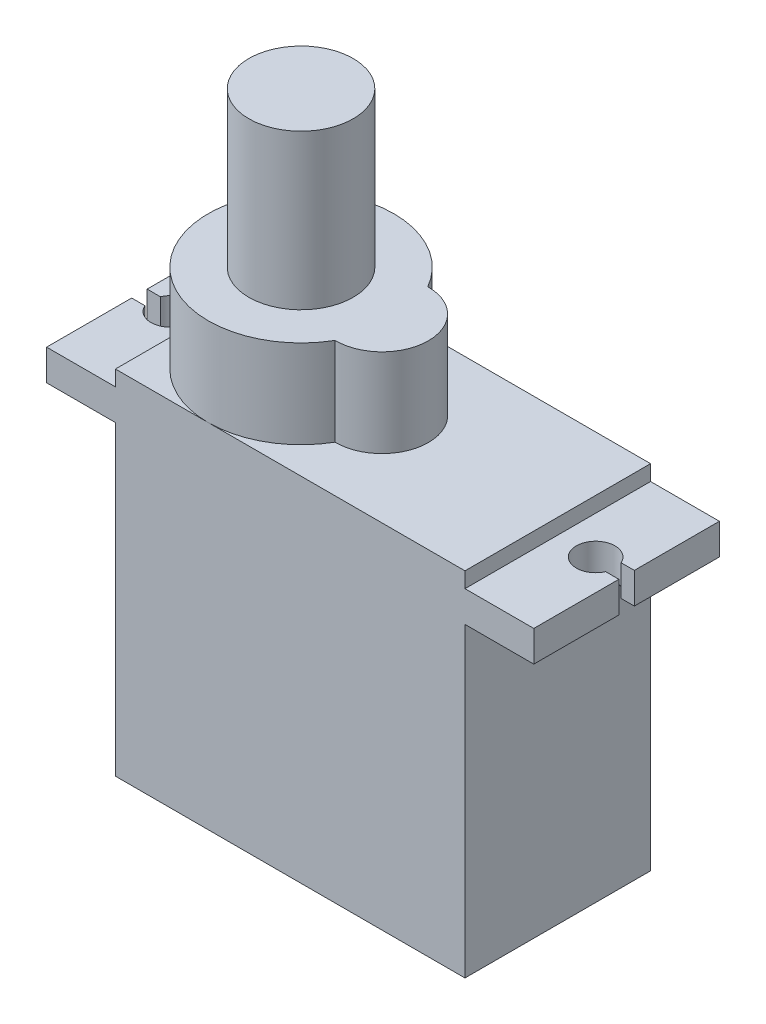
ISO-10303-21;
HEADER;
FILE_DESCRIPTION(('STEP AP214'),'2;1');
FILE_NAME('part.step','',(''),(''),'','','');
FILE_SCHEMA(('AUTOMOTIVE_DESIGN { 1 0 10303 214 1 1 1 1 }'));
ENDSEC;
DATA;
#1=APPLICATION_CONTEXT('core data for automotive mechanical design processes');
#2=APPLICATION_PROTOCOL_DEFINITION('international standard','automotive_design',2000,#1);
#3=PRODUCT_CONTEXT('',#1,'mechanical');
#4=PRODUCT('Part','Part','',(#3));
#5=PRODUCT_RELATED_PRODUCT_CATEGORY('part','',(#4));
#6=PRODUCT_DEFINITION_FORMATION('','',#4);
#7=PRODUCT_DEFINITION_CONTEXT('part definition',#1,'design');
#8=PRODUCT_DEFINITION('design','',#6,#7);
#9=PRODUCT_DEFINITION_SHAPE('','',#8);
#10=(LENGTH_UNIT() NAMED_UNIT(*) SI_UNIT(.MILLI.,.METRE.));
#11=(NAMED_UNIT(*) PLANE_ANGLE_UNIT() SI_UNIT($,.RADIAN.));
#12=(NAMED_UNIT(*) SI_UNIT($,.STERADIAN.) SOLID_ANGLE_UNIT());
#13=UNCERTAINTY_MEASURE_WITH_UNIT(LENGTH_MEASURE(1.E-05),#10,'distance_accuracy_value','');
#14=(GEOMETRIC_REPRESENTATION_CONTEXT(3) GLOBAL_UNCERTAINTY_ASSIGNED_CONTEXT((#13)) GLOBAL_UNIT_ASSIGNED_CONTEXT((#10,
#11,#12)) REPRESENTATION_CONTEXT('',''));
#15=CARTESIAN_POINT('',(0.,0.,0.));
#16=DIRECTION('',(0.,0.,1.));
#17=DIRECTION('',(1.,0.,0.));
#18=AXIS2_PLACEMENT_3D('',#15,#16,#17);
#19=CARTESIAN_POINT('',(0.,21.8,0.));
#20=DIRECTION('',(0.,1.,0.));
#21=DIRECTION('',(0.,0.,1.));
#22=AXIS2_PLACEMENT_3D('',#19,#20,#21);
#23=PLANE('',#22);
#24=CARTESIAN_POINT('',(-2.45,21.8,-6.));
#25=DIRECTION('',(0.,1.,0.));
#26=DIRECTION('',(0.,0.,1.));
#27=AXIS2_PLACEMENT_3D('',#24,#25,#26);
#28=CIRCLE('',#27,1.25);
#29=CARTESIAN_POINT('',(-3.59564392373896,21.8,-5.5));
#30=VERTEX_POINT('',#29);
#31=CARTESIAN_POINT('',(-3.59564392373896,21.8,-6.5));
#32=VERTEX_POINT('',#31);
#33=EDGE_CURVE('E234',#30,#32,#28,.T.);
#34=ORIENTED_EDGE('',*,*,#33,.F.);
#35=DIRECTION('',(-1.,0.,0.));
#36=VECTOR('',#35,1.);
#37=CARTESIAN_POINT('',(0.,21.8,-5.5));
#38=LINE('',#37,#36);
#39=CARTESIAN_POINT('',(-4.45,21.8,-5.5));
#40=VERTEX_POINT('',#39);
#41=EDGE_CURVE('E208',#30,#40,#38,.T.);
#42=ORIENTED_EDGE('',*,*,#41,.T.);
#43=DIRECTION('',(0.,0.,1.));
#44=VECTOR('',#43,1.);
#45=CARTESIAN_POINT('',(-4.45,21.8,-12.));
#46=LINE('',#45,#44);
#47=CARTESIAN_POINT('',(-4.45,21.8,0.));
#48=VERTEX_POINT('',#47);
#49=EDGE_CURVE('E355',#40,#48,#46,.T.);
#50=ORIENTED_EDGE('',*,*,#49,.T.);
#51=DIRECTION('',(1.,0.,0.));
#52=VECTOR('',#51,1.);
#53=CARTESIAN_POINT('',(-4.45,21.8,0.));
#54=LINE('',#53,#52);
#55=CARTESIAN_POINT('',(0.,21.8,0.));
#56=VERTEX_POINT('',#55);
#57=EDGE_CURVE('E362',#48,#56,#54,.T.);
#58=ORIENTED_EDGE('',*,*,#57,.T.);
#59=DIRECTION('',(0.,0.,1.));
#60=VECTOR('',#59,1.);
#61=CARTESIAN_POINT('',(0.,21.8,0.));
#62=LINE('',#61,#60);
#63=CARTESIAN_POINT('',(0.,21.8,-12.));
#64=VERTEX_POINT('',#63);
#65=EDGE_CURVE('E309',#64,#56,#62,.T.);
#66=ORIENTED_EDGE('',*,*,#65,.F.);
#67=DIRECTION('',(-1.,0.,0.));
#68=VECTOR('',#67,1.);
#69=CARTESIAN_POINT('',(27.05,21.8,-12.));
#70=LINE('',#69,#68);
#71=CARTESIAN_POINT('',(-4.45,21.8,-12.));
#72=VERTEX_POINT('',#71);
#73=EDGE_CURVE('E356',#64,#72,#70,.T.);
#74=ORIENTED_EDGE('',*,*,#73,.T.);
#75=CARTESIAN_POINT('',(-4.45,21.8,-6.5));
#76=VERTEX_POINT('',#75);
#77=EDGE_CURVE('E357',#72,#76,#46,.T.);
#78=ORIENTED_EDGE('',*,*,#77,.T.);
#79=DIRECTION('',(1.,0.,0.));
#80=VECTOR('',#79,1.);
#81=CARTESIAN_POINT('',(0.,21.8,-6.5));
#82=LINE('',#81,#80);
#83=EDGE_CURVE('E59',#76,#32,#82,.T.);
#84=ORIENTED_EDGE('',*,*,#83,.T.);
#85=EDGE_LOOP('',(#34,#42,#50,#58,#66,#74,#78,#84));
#86=FACE_BOUND('',#85,.T.);
#87=ADVANCED_FACE('F41',(#86),#23,.T.);
#88=CARTESIAN_POINT('',(0.,19.8,0.));
#89=DIRECTION('',(0.,1.,0.));
#90=DIRECTION('',(0.,0.,1.));
#91=AXIS2_PLACEMENT_3D('',#88,#89,#90);
#92=PLANE('',#91);
#93=DIRECTION('',(1.,0.,0.));
#94=VECTOR('',#93,1.);
#95=CARTESIAN_POINT('',(0.,19.8,-5.5));
#96=LINE('',#95,#94);
#97=CARTESIAN_POINT('',(-4.45,19.8,-5.5));
#98=VERTEX_POINT('',#97);
#99=CARTESIAN_POINT('',(-3.59564392373896,19.8,-5.5));
#100=VERTEX_POINT('',#99);
#101=EDGE_CURVE('E205',#98,#100,#96,.T.);
#102=ORIENTED_EDGE('',*,*,#101,.T.);
#103=CARTESIAN_POINT('',(-2.45,19.8,-6.));
#104=DIRECTION('',(0.,1.,0.));
#105=DIRECTION('',(0.,0.,1.));
#106=AXIS2_PLACEMENT_3D('',#103,#104,#105);
#107=CIRCLE('',#106,1.25);
#108=CARTESIAN_POINT('',(-3.59564392373896,19.8,-6.5));
#109=VERTEX_POINT('',#108);
#110=EDGE_CURVE('E216',#109,#100,#107,.F.);
#111=ORIENTED_EDGE('',*,*,#110,.F.);
#112=DIRECTION('',(-1.,0.,0.));
#113=VECTOR('',#112,1.);
#114=CARTESIAN_POINT('',(0.,19.8,-6.5));
#115=LINE('',#114,#113);
#116=CARTESIAN_POINT('',(-4.45,19.8,-6.5));
#117=VERTEX_POINT('',#116);
#118=EDGE_CURVE('E230',#109,#117,#115,.T.);
#119=ORIENTED_EDGE('',*,*,#118,.T.);
#120=DIRECTION('',(0.,0.,1.));
#121=VECTOR('',#120,1.);
#122=CARTESIAN_POINT('',(-4.45,19.8,-12.));
#123=LINE('',#122,#121);
#124=CARTESIAN_POINT('',(-4.45,19.8,-12.));
#125=VERTEX_POINT('',#124);
#126=EDGE_CURVE('E375',#125,#117,#123,.T.);
#127=ORIENTED_EDGE('',*,*,#126,.F.);
#128=DIRECTION('',(-1.,0.,0.));
#129=VECTOR('',#128,1.);
#130=CARTESIAN_POINT('',(27.05,19.8,-12.));
#131=LINE('',#130,#129);
#132=CARTESIAN_POINT('',(0.,19.8,-12.));
#133=VERTEX_POINT('',#132);
#134=EDGE_CURVE('E351',#133,#125,#131,.T.);
#135=ORIENTED_EDGE('',*,*,#134,.F.);
#136=DIRECTION('',(0.,0.,1.));
#137=VECTOR('',#136,1.);
#138=CARTESIAN_POINT('',(0.,19.8,0.));
#139=LINE('',#138,#137);
#140=CARTESIAN_POINT('',(0.,19.8,0.));
#141=VERTEX_POINT('',#140);
#142=EDGE_CURVE('E405',#133,#141,#139,.T.);
#143=ORIENTED_EDGE('',*,*,#142,.T.);
#144=DIRECTION('',(1.,0.,0.));
#145=VECTOR('',#144,1.);
#146=CARTESIAN_POINT('',(-4.45,19.8,0.));
#147=LINE('',#146,#145);
#148=CARTESIAN_POINT('',(-4.45,19.8,0.));
#149=VERTEX_POINT('',#148);
#150=EDGE_CURVE('E380',#149,#141,#147,.T.);
#151=ORIENTED_EDGE('',*,*,#150,.F.);
#152=EDGE_CURVE('E228',#98,#149,#123,.T.);
#153=ORIENTED_EDGE('',*,*,#152,.F.);
#154=EDGE_LOOP('',(#102,#111,#119,#127,#135,#143,#151,#153));
#155=FACE_BOUND('',#154,.T.);
#156=ADVANCED_FACE('F226',(#155),#92,.F.);
#157=CARTESIAN_POINT('',(-4.45,21.8,-12.));
#158=DIRECTION('',(1.,0.,0.));
#159=DIRECTION('',(0.,0.,-1.));
#160=AXIS2_PLACEMENT_3D('',#157,#158,#159);
#161=PLANE('',#160);
#162=DIRECTION('',(0.,1.,0.));
#163=VECTOR('',#162,1.);
#164=CARTESIAN_POINT('',(-4.45,-0.001000000000001,-5.5));
#165=LINE('',#164,#163);
#166=EDGE_CURVE('E223',#98,#40,#165,.T.);
#167=ORIENTED_EDGE('',*,*,#166,.F.);
#168=ORIENTED_EDGE('',*,*,#152,.T.);
#169=DIRECTION('',(0.,-1.,0.));
#170=VECTOR('',#169,1.);
#171=CARTESIAN_POINT('',(-4.45,21.8,0.));
#172=LINE('',#171,#170);
#173=EDGE_CURVE('E396',#48,#149,#172,.T.);
#174=ORIENTED_EDGE('',*,*,#173,.F.);
#175=ORIENTED_EDGE('',*,*,#49,.F.);
#176=EDGE_LOOP('',(#167,#168,#174,#175));
#177=FACE_BOUND('',#176,.T.);
#178=ADVANCED_FACE('F535',(#177),#161,.F.);
#179=DIRECTION('',(0.,1.,0.));
#180=VECTOR('',#179,1.);
#181=CARTESIAN_POINT('',(-4.45,-0.001000000000001,-6.5));
#182=LINE('',#181,#180);
#183=EDGE_CURVE('E245',#117,#76,#182,.T.);
#184=ORIENTED_EDGE('',*,*,#183,.T.);
#185=ORIENTED_EDGE('',*,*,#77,.F.);
#186=DIRECTION('',(0.,-1.,0.));
#187=VECTOR('',#186,1.);
#188=CARTESIAN_POINT('',(-4.45,21.8,-12.));
#189=LINE('',#188,#187);
#190=EDGE_CURVE('E400',#72,#125,#189,.T.);
#191=ORIENTED_EDGE('',*,*,#190,.T.);
#192=ORIENTED_EDGE('',*,*,#126,.T.);
#193=EDGE_LOOP('',(#184,#185,#191,#192));
#194=FACE_BOUND('',#193,.T.);
#195=ADVANCED_FACE('F550',(#194),#161,.F.);
#196=CARTESIAN_POINT('',(27.05,21.8,0.));
#197=DIRECTION('',(-1.,0.,0.));
#198=DIRECTION('',(0.,0.,1.));
#199=AXIS2_PLACEMENT_3D('',#196,#197,#198);
#200=PLANE('',#199);
#201=DIRECTION('',(0.,0.,-1.));
#202=VECTOR('',#201,1.);
#203=CARTESIAN_POINT('',(27.05,21.8,0.));
#204=LINE('',#203,#202);
#205=CARTESIAN_POINT('',(27.05,21.8,-6.5));
#206=VERTEX_POINT('',#205);
#207=CARTESIAN_POINT('',(27.05,21.8,-12.));
#208=VERTEX_POINT('',#207);
#209=EDGE_CURVE('E365',#206,#208,#204,.T.);
#210=ORIENTED_EDGE('',*,*,#209,.F.);
#211=DIRECTION('',(0.,1.,0.));
#212=VECTOR('',#211,1.);
#213=CARTESIAN_POINT('',(27.05,-0.001000000000001,-6.5));
#214=LINE('',#213,#212);
#215=CARTESIAN_POINT('',(27.05,19.8,-6.5));
#216=VERTEX_POINT('',#215);
#217=EDGE_CURVE('E270',#216,#206,#214,.T.);
#218=ORIENTED_EDGE('',*,*,#217,.F.);
#219=DIRECTION('',(0.,0.,-1.));
#220=VECTOR('',#219,1.);
#221=CARTESIAN_POINT('',(27.05,19.8,0.));
#222=LINE('',#221,#220);
#223=CARTESIAN_POINT('',(27.05,19.8,-12.));
#224=VERTEX_POINT('',#223);
#225=EDGE_CURVE('E384',#216,#224,#222,.T.);
#226=ORIENTED_EDGE('',*,*,#225,.T.);
#227=DIRECTION('',(0.,-1.,0.));
#228=VECTOR('',#227,1.);
#229=CARTESIAN_POINT('',(27.05,21.8,-12.));
#230=LINE('',#229,#228);
#231=EDGE_CURVE('E370',#208,#224,#230,.T.);
#232=ORIENTED_EDGE('',*,*,#231,.F.);
#233=EDGE_LOOP('',(#210,#218,#226,#232));
#234=FACE_BOUND('',#233,.T.);
#235=ADVANCED_FACE('F480',(#234),#200,.F.);
#236=CARTESIAN_POINT('',(0.,22.8,0.));
#237=DIRECTION('',(0.,-1.,0.));
#238=DIRECTION('',(0.,0.,-1.));
#239=AXIS2_PLACEMENT_3D('',#236,#237,#238);
#240=PLANE('',#239);
#241=CARTESIAN_POINT('',(6.,22.8,-6.));
#242=DIRECTION('',(0.,1.,0.));
#243=DIRECTION('',(0.,0.,1.));
#244=AXIS2_PLACEMENT_3D('',#241,#242,#243);
#245=CIRCLE('',#244,6.);
#246=CARTESIAN_POINT('',(11.1963070609208,22.8,-8.99973214281289));
#247=VERTEX_POINT('',#246);
#248=CARTESIAN_POINT('',(6.,22.8,-12.));
#249=VERTEX_POINT('',#248);
#250=EDGE_CURVE('E284',#247,#249,#245,.T.);
#251=ORIENTED_EDGE('',*,*,#250,.F.);
#252=CARTESIAN_POINT('',(11.236395355661,22.8,-6.));
#253=DIRECTION('',(0.,1.,0.));
#254=DIRECTION('',(0.,0.,1.));
#255=AXIS2_PLACEMENT_3D('',#252,#253,#254);
#256=CIRCLE('',#255,3.);
#257=CARTESIAN_POINT('',(11.1963070609208,22.8,-3.00026785718711));
#258=VERTEX_POINT('',#257);
#259=EDGE_CURVE('E291',#258,#247,#256,.T.);
#260=ORIENTED_EDGE('',*,*,#259,.F.);
#261=CARTESIAN_POINT('',(6.,22.8,0.));
#262=VERTEX_POINT('',#261);
#263=EDGE_CURVE('E298',#262,#258,#245,.T.);
#264=ORIENTED_EDGE('',*,*,#263,.F.);
#265=DIRECTION('',(1.,0.,0.));
#266=VECTOR('',#265,1.);
#267=CARTESIAN_POINT('',(0.,22.8,0.));
#268=LINE('',#267,#266);
#269=CARTESIAN_POINT('',(22.6,22.8,0.));
#270=VERTEX_POINT('',#269);
#271=EDGE_CURVE('E314',#262,#270,#268,.T.);
#272=ORIENTED_EDGE('',*,*,#271,.T.);
#273=DIRECTION('',(0.,0.,-1.));
#274=VECTOR('',#273,1.);
#275=CARTESIAN_POINT('',(22.6,22.8,0.));
#276=LINE('',#275,#274);
#277=CARTESIAN_POINT('',(22.6,22.8,-12.));
#278=VERTEX_POINT('',#277);
#279=EDGE_CURVE('E320',#270,#278,#276,.T.);
#280=ORIENTED_EDGE('',*,*,#279,.T.);
#281=DIRECTION('',(-1.,0.,0.));
#282=VECTOR('',#281,1.);
#283=CARTESIAN_POINT('',(0.,22.8,-12.));
#284=LINE('',#283,#282);
#285=EDGE_CURVE('E324',#278,#249,#284,.T.);
#286=ORIENTED_EDGE('',*,*,#285,.T.);
#287=EDGE_LOOP('',(#251,#260,#264,#272,#280,#286));
#288=FACE_BOUND('',#287,.T.);
#289=ADVANCED_FACE('F462',(#288),#240,.F.);
#290=CARTESIAN_POINT('',(0.,22.8,-6.));
#291=VERTEX_POINT('',#290);
#292=EDGE_CURVE('E51',#249,#291,#245,.T.);
#293=ORIENTED_EDGE('',*,*,#292,.F.);
#294=CARTESIAN_POINT('',(0.,22.8,-12.));
#295=VERTEX_POINT('',#294);
#296=EDGE_CURVE('E323',#249,#295,#284,.T.);
#297=ORIENTED_EDGE('',*,*,#296,.T.);
#298=DIRECTION('',(0.,0.,1.));
#299=VECTOR('',#298,1.);
#300=CARTESIAN_POINT('',(0.,22.8,0.));
#301=LINE('',#300,#299);
#302=EDGE_CURVE('E310',#295,#291,#301,.T.);
#303=ORIENTED_EDGE('',*,*,#302,.T.);
#304=EDGE_LOOP('',(#293,#297,#303));
#305=FACE_BOUND('',#304,.T.);
#306=ADVANCED_FACE('F453',(#305),#240,.F.);
#307=CARTESIAN_POINT('',(0.,19.8,0.));
#308=DIRECTION('',(1.,0.,0.));
#309=DIRECTION('',(0.,0.,-1.));
#310=AXIS2_PLACEMENT_3D('',#307,#308,#309);
#311=PLANE('',#310);
#312=DIRECTION('',(0.,0.,1.));
#313=VECTOR('',#312,1.);
#314=CARTESIAN_POINT('',(0.,0.,0.));
#315=LINE('',#314,#313);
#316=CARTESIAN_POINT('',(0.,0.,-12.));
#317=VERTEX_POINT('',#316);
#318=CARTESIAN_POINT('',(0.,0.,0.));
#319=VERTEX_POINT('',#318);
#320=EDGE_CURVE('E404',#317,#319,#315,.T.);
#321=ORIENTED_EDGE('',*,*,#320,.T.);
#322=DIRECTION('',(0.,-1.,0.));
#323=VECTOR('',#322,1.);
#324=CARTESIAN_POINT('',(0.,19.8,0.));
#325=LINE('',#324,#323);
#326=EDGE_CURVE('E45',#141,#319,#325,.T.);
#327=ORIENTED_EDGE('',*,*,#326,.F.);
#328=ORIENTED_EDGE('',*,*,#142,.F.);
#329=DIRECTION('',(0.,-1.,0.));
#330=VECTOR('',#329,1.);
#331=CARTESIAN_POINT('',(0.,19.8,-12.));
#332=LINE('',#331,#330);
#333=EDGE_CURVE('E414',#133,#317,#332,.T.);
#334=ORIENTED_EDGE('',*,*,#333,.T.);
#335=EDGE_LOOP('',(#321,#327,#328,#334));
#336=FACE_BOUND('',#335,.T.);
#337=ADVANCED_FACE('F43',(#336),#311,.F.);
#338=CARTESIAN_POINT('',(0.,19.8,0.));
#339=DIRECTION('',(0.,0.,-1.));
#340=DIRECTION('',(-1.,0.,0.));
#341=AXIS2_PLACEMENT_3D('',#338,#339,#340);
#342=PLANE('',#341);
#343=DIRECTION('',(1.,0.,0.));
#344=VECTOR('',#343,1.);
#345=CARTESIAN_POINT('',(0.,0.,0.));
#346=LINE('',#345,#344);
#347=CARTESIAN_POINT('',(22.6,0.,0.));
#348=VERTEX_POINT('',#347);
#349=EDGE_CURVE('E418',#319,#348,#346,.T.);
#350=ORIENTED_EDGE('',*,*,#349,.T.);
#351=DIRECTION('',(0.,-1.,0.));
#352=VECTOR('',#351,1.);
#353=CARTESIAN_POINT('',(22.6,19.8,0.));
#354=LINE('',#353,#352);
#355=CARTESIAN_POINT('',(22.6,19.8,0.));
#356=VERTEX_POINT('',#355);
#357=EDGE_CURVE('E432',#356,#348,#354,.T.);
#358=ORIENTED_EDGE('',*,*,#357,.F.);
#359=CARTESIAN_POINT('',(27.05,19.8,0.));
#360=VERTEX_POINT('',#359);
#361=EDGE_CURVE('E379',#356,#360,#147,.T.);
#362=ORIENTED_EDGE('',*,*,#361,.T.);
#363=DIRECTION('',(0.,-1.,0.));
#364=VECTOR('',#363,1.);
#365=CARTESIAN_POINT('',(27.05,21.8,0.));
#366=LINE('',#365,#364);
#367=CARTESIAN_POINT('',(27.05,21.8,0.));
#368=VERTEX_POINT('',#367);
#369=EDGE_CURVE('E392',#368,#360,#366,.T.);
#370=ORIENTED_EDGE('',*,*,#369,.F.);
#371=CARTESIAN_POINT('',(22.6,21.8,0.));
#372=VERTEX_POINT('',#371);
#373=EDGE_CURVE('E361',#372,#368,#54,.T.);
#374=ORIENTED_EDGE('',*,*,#373,.F.);
#375=DIRECTION('',(0.,-1.,0.));
#376=VECTOR('',#375,1.);
#377=CARTESIAN_POINT('',(22.6,22.8,0.));
#378=LINE('',#377,#376);
#379=EDGE_CURVE('E343',#270,#372,#378,.T.);
#380=ORIENTED_EDGE('',*,*,#379,.F.);
#381=ORIENTED_EDGE('',*,*,#271,.F.);
#382=CARTESIAN_POINT('',(0.,22.8,0.));
#383=VERTEX_POINT('',#382);
#384=EDGE_CURVE('E316',#383,#262,#268,.T.);
#385=ORIENTED_EDGE('',*,*,#384,.F.);
#386=DIRECTION('',(0.,-1.,0.));
#387=VECTOR('',#386,1.);
#388=CARTESIAN_POINT('',(0.,22.8,0.));
#389=LINE('',#388,#387);
#390=EDGE_CURVE('E347',#383,#56,#389,.T.);
#391=ORIENTED_EDGE('',*,*,#390,.T.);
#392=ORIENTED_EDGE('',*,*,#57,.F.);
#393=ORIENTED_EDGE('',*,*,#173,.T.);
#394=ORIENTED_EDGE('',*,*,#150,.T.);
#395=ORIENTED_EDGE('',*,*,#326,.T.);
#396=EDGE_LOOP('',(#350,#358,#362,#370,#374,#380,#381,#385,#391,#392,#393,#394,#395));
#397=FACE_BOUND('',#396,.T.);
#398=ADVANCED_FACE('F497',(#397),#342,.F.);
#399=CARTESIAN_POINT('',(22.6,19.8,0.));
#400=DIRECTION('',(-1.,0.,0.));
#401=DIRECTION('',(0.,0.,1.));
#402=AXIS2_PLACEMENT_3D('',#399,#400,#401);
#403=PLANE('',#402);
#404=DIRECTION('',(0.,0.,-1.));
#405=VECTOR('',#404,1.);
#406=CARTESIAN_POINT('',(22.6,0.,0.));
#407=LINE('',#406,#405);
#408=CARTESIAN_POINT('',(22.6,0.,-12.));
#409=VERTEX_POINT('',#408);
#410=EDGE_CURVE('E421',#348,#409,#407,.T.);
#411=ORIENTED_EDGE('',*,*,#410,.T.);
#412=DIRECTION('',(0.,-1.,0.));
#413=VECTOR('',#412,1.);
#414=CARTESIAN_POINT('',(22.6,19.8,-12.));
#415=LINE('',#414,#413);
#416=CARTESIAN_POINT('',(22.6,19.8,-12.));
#417=VERTEX_POINT('',#416);
#418=EDGE_CURVE('E429',#417,#409,#415,.T.);
#419=ORIENTED_EDGE('',*,*,#418,.F.);
#420=DIRECTION('',(0.,0.,-1.));
#421=VECTOR('',#420,1.);
#422=CARTESIAN_POINT('',(22.6,19.8,0.));
#423=LINE('',#422,#421);
#424=EDGE_CURVE('E409',#356,#417,#423,.T.);
#425=ORIENTED_EDGE('',*,*,#424,.F.);
#426=ORIENTED_EDGE('',*,*,#357,.T.);
#427=EDGE_LOOP('',(#411,#419,#425,#426));
#428=FACE_BOUND('',#427,.T.);
#429=ADVANCED_FACE('F567',(#428),#403,.F.);
#430=CARTESIAN_POINT('',(0.,19.8,-12.));
#431=DIRECTION('',(0.,0.,1.));
#432=DIRECTION('',(1.,0.,0.));
#433=AXIS2_PLACEMENT_3D('',#430,#431,#432);
#434=PLANE('',#433);
#435=DIRECTION('',(-1.,0.,0.));
#436=VECTOR('',#435,1.);
#437=CARTESIAN_POINT('',(0.,0.,-12.));
#438=LINE('',#437,#436);
#439=EDGE_CURVE('E410',#409,#317,#438,.T.);
#440=ORIENTED_EDGE('',*,*,#439,.T.);
#441=ORIENTED_EDGE('',*,*,#333,.F.);
#442=ORIENTED_EDGE('',*,*,#134,.T.);
#443=ORIENTED_EDGE('',*,*,#190,.F.);
#444=ORIENTED_EDGE('',*,*,#73,.F.);
#445=DIRECTION('',(0.,-1.,0.));
#446=VECTOR('',#445,1.);
#447=CARTESIAN_POINT('',(0.,22.8,-12.));
#448=LINE('',#447,#446);
#449=EDGE_CURVE('E328',#295,#64,#448,.T.);
#450=ORIENTED_EDGE('',*,*,#449,.F.);
#451=ORIENTED_EDGE('',*,*,#296,.F.);
#452=ORIENTED_EDGE('',*,*,#285,.F.);
#453=DIRECTION('',(0.,-1.,0.));
#454=VECTOR('',#453,1.);
#455=CARTESIAN_POINT('',(22.6,22.8,-12.));
#456=LINE('',#455,#454);
#457=CARTESIAN_POINT('',(22.6,21.8,-12.));
#458=VERTEX_POINT('',#457);
#459=EDGE_CURVE('E339',#278,#458,#456,.T.);
#460=ORIENTED_EDGE('',*,*,#459,.T.);
#461=EDGE_CURVE('E352',#208,#458,#70,.T.);
#462=ORIENTED_EDGE('',*,*,#461,.F.);
#463=ORIENTED_EDGE('',*,*,#231,.T.);
#464=EDGE_CURVE('E371',#224,#417,#131,.T.);
#465=ORIENTED_EDGE('',*,*,#464,.T.);
#466=ORIENTED_EDGE('',*,*,#418,.T.);
#467=EDGE_LOOP('',(#440,#441,#442,#443,#444,#450,#451,#452,#460,#462,#463,#465,#466));
#468=FACE_BOUND('',#467,.T.);
#469=ADVANCED_FACE('F458',(#468),#434,.F.);
#470=CARTESIAN_POINT('',(0.,0.,0.));
#471=DIRECTION('',(0.,-1.,0.));
#472=DIRECTION('',(0.,0.,-1.));
#473=AXIS2_PLACEMENT_3D('',#470,#471,#472);
#474=PLANE('',#473);
#475=ORIENTED_EDGE('',*,*,#320,.F.);
#476=ORIENTED_EDGE('',*,*,#439,.F.);
#477=ORIENTED_EDGE('',*,*,#410,.F.);
#478=ORIENTED_EDGE('',*,*,#349,.F.);
#479=EDGE_LOOP('',(#475,#476,#477,#478));
#480=FACE_BOUND('',#479,.T.);
#481=ADVANCED_FACE('F547',(#480),#474,.T.);
#482=ORIENTED_EDGE('',*,*,#225,.F.);
#483=DIRECTION('',(1.,0.,0.));
#484=VECTOR('',#483,1.);
#485=CARTESIAN_POINT('',(0.,19.8,-6.49999999999999));
#486=LINE('',#485,#484);
#487=CARTESIAN_POINT('',(26.195643923739,19.8,-6.5));
#488=VERTEX_POINT('',#487);
#489=EDGE_CURVE('E254',#488,#216,#486,.T.);
#490=ORIENTED_EDGE('',*,*,#489,.F.);
#491=CARTESIAN_POINT('',(25.05,19.8,-6.));
#492=DIRECTION('',(0.,1.,0.));
#493=DIRECTION('',(0.,0.,1.));
#494=AXIS2_PLACEMENT_3D('',#491,#492,#493);
#495=CIRCLE('',#494,1.25);
#496=CARTESIAN_POINT('',(26.195643923739,19.8,-5.5));
#497=VERTEX_POINT('',#496);
#498=EDGE_CURVE('E250',#497,#488,#495,.F.);
#499=ORIENTED_EDGE('',*,*,#498,.F.);
#500=DIRECTION('',(-1.,0.,0.));
#501=VECTOR('',#500,1.);
#502=CARTESIAN_POINT('',(0.,19.8,-5.5));
#503=LINE('',#502,#501);
#504=CARTESIAN_POINT('',(27.05,19.8,-5.5));
#505=VERTEX_POINT('',#504);
#506=EDGE_CURVE('E236',#505,#497,#503,.T.);
#507=ORIENTED_EDGE('',*,*,#506,.F.);
#508=EDGE_CURVE('E385',#360,#505,#222,.T.);
#509=ORIENTED_EDGE('',*,*,#508,.F.);
#510=ORIENTED_EDGE('',*,*,#361,.F.);
#511=ORIENTED_EDGE('',*,*,#424,.T.);
#512=ORIENTED_EDGE('',*,*,#464,.F.);
#513=EDGE_LOOP('',(#482,#490,#499,#507,#509,#510,#511,#512));
#514=FACE_BOUND('',#513,.T.);
#515=ADVANCED_FACE('F516',(#514),#92,.F.);
#516=ORIENTED_EDGE('',*,*,#508,.T.);
#517=DIRECTION('',(0.,1.,0.));
#518=VECTOR('',#517,1.);
#519=CARTESIAN_POINT('',(27.05,-0.001000000000001,-5.5));
#520=LINE('',#519,#518);
#521=CARTESIAN_POINT('',(27.05,21.8,-5.5));
#522=VERTEX_POINT('',#521);
#523=EDGE_CURVE('E273',#505,#522,#520,.T.);
#524=ORIENTED_EDGE('',*,*,#523,.T.);
#525=EDGE_CURVE('E366',#368,#522,#204,.T.);
#526=ORIENTED_EDGE('',*,*,#525,.F.);
#527=ORIENTED_EDGE('',*,*,#369,.T.);
#528=EDGE_LOOP('',(#516,#524,#526,#527));
#529=FACE_BOUND('',#528,.T.);
#530=ADVANCED_FACE('F511',(#529),#200,.F.);
#531=DIRECTION('',(-1.,0.,0.));
#532=VECTOR('',#531,1.);
#533=CARTESIAN_POINT('',(0.,21.8,-6.49999999999999));
#534=LINE('',#533,#532);
#535=CARTESIAN_POINT('',(26.195643923739,21.8,-6.5));
#536=VERTEX_POINT('',#535);
#537=EDGE_CURVE('E262',#206,#536,#534,.T.);
#538=ORIENTED_EDGE('',*,*,#537,.F.);
#539=ORIENTED_EDGE('',*,*,#209,.T.);
#540=ORIENTED_EDGE('',*,*,#461,.T.);
#541=DIRECTION('',(0.,0.,-1.));
#542=VECTOR('',#541,1.);
#543=CARTESIAN_POINT('',(22.6,21.8,0.));
#544=LINE('',#543,#542);
#545=EDGE_CURVE('E332',#372,#458,#544,.T.);
#546=ORIENTED_EDGE('',*,*,#545,.F.);
#547=ORIENTED_EDGE('',*,*,#373,.T.);
#548=ORIENTED_EDGE('',*,*,#525,.T.);
#549=DIRECTION('',(1.,0.,0.));
#550=VECTOR('',#549,1.);
#551=CARTESIAN_POINT('',(0.,21.8,-5.5));
#552=LINE('',#551,#550);
#553=CARTESIAN_POINT('',(26.195643923739,21.8,-5.5));
#554=VERTEX_POINT('',#553);
#555=EDGE_CURVE('E259',#554,#522,#552,.T.);
#556=ORIENTED_EDGE('',*,*,#555,.F.);
#557=CARTESIAN_POINT('',(25.05,21.8,-6.));
#558=DIRECTION('',(0.,1.,0.));
#559=DIRECTION('',(0.,0.,1.));
#560=AXIS2_PLACEMENT_3D('',#557,#558,#559);
#561=CIRCLE('',#560,1.25);
#562=EDGE_CURVE('E67',#536,#554,#561,.T.);
#563=ORIENTED_EDGE('',*,*,#562,.F.);
#564=EDGE_LOOP('',(#538,#539,#540,#546,#547,#548,#556,#563));
#565=FACE_BOUND('',#564,.T.);
#566=ADVANCED_FACE('F474',(#565),#23,.T.);
#567=CARTESIAN_POINT('',(0.,22.8,0.));
#568=DIRECTION('',(1.,0.,0.));
#569=DIRECTION('',(0.,0.,-1.));
#570=AXIS2_PLACEMENT_3D('',#567,#568,#569);
#571=PLANE('',#570);
#572=ORIENTED_EDGE('',*,*,#65,.T.);
#573=ORIENTED_EDGE('',*,*,#390,.F.);
#574=EDGE_CURVE('E315',#291,#383,#301,.T.);
#575=ORIENTED_EDGE('',*,*,#574,.F.);
#576=ORIENTED_EDGE('',*,*,#302,.F.);
#577=ORIENTED_EDGE('',*,*,#449,.T.);
#578=EDGE_LOOP('',(#572,#573,#575,#576,#577));
#579=FACE_BOUND('',#578,.T.);
#580=ADVANCED_FACE('F499',(#579),#571,.F.);
#581=CARTESIAN_POINT('',(22.6,22.8,0.));
#582=DIRECTION('',(-1.,0.,0.));
#583=DIRECTION('',(0.,0.,1.));
#584=AXIS2_PLACEMENT_3D('',#581,#582,#583);
#585=PLANE('',#584);
#586=ORIENTED_EDGE('',*,*,#545,.T.);
#587=ORIENTED_EDGE('',*,*,#459,.F.);
#588=ORIENTED_EDGE('',*,*,#279,.F.);
#589=ORIENTED_EDGE('',*,*,#379,.T.);
#590=EDGE_LOOP('',(#586,#587,#588,#589));
#591=FACE_BOUND('',#590,.T.);
#592=ADVANCED_FACE('F468',(#591),#585,.F.);
#593=EDGE_CURVE('E443',#291,#262,#245,.T.);
#594=ORIENTED_EDGE('',*,*,#593,.F.);
#595=ORIENTED_EDGE('',*,*,#574,.T.);
#596=ORIENTED_EDGE('',*,*,#384,.T.);
#597=EDGE_LOOP('',(#594,#595,#596));
#598=FACE_BOUND('',#597,.T.);
#599=ADVANCED_FACE('F494',(#598),#240,.F.);
#600=CARTESIAN_POINT('',(6.,28.5,-6.));
#601=DIRECTION('',(0.,-1.,0.));
#602=DIRECTION('',(0.,0.,-1.));
#603=AXIS2_PLACEMENT_3D('',#600,#601,#602);
#604=CYLINDRICAL_SURFACE('',#603,6.);
#605=ORIENTED_EDGE('',*,*,#250,.T.);
#606=ORIENTED_EDGE('',*,*,#292,.T.);
#607=ORIENTED_EDGE('',*,*,#593,.T.);
#608=ORIENTED_EDGE('',*,*,#263,.T.);
#609=DIRECTION('',(0.,-1.,0.));
#610=VECTOR('',#609,1.);
#611=CARTESIAN_POINT('',(11.1963070609208,28.5,-3.00026785718711));
#612=LINE('',#611,#610);
#613=CARTESIAN_POINT('',(11.1963070609208,28.5,-3.00026785718711));
#614=VERTEX_POINT('',#613);
#615=EDGE_CURVE('E305',#614,#258,#612,.T.);
#616=ORIENTED_EDGE('',*,*,#615,.F.);
#617=CARTESIAN_POINT('',(6.,28.5,-6.));
#618=DIRECTION('',(0.,1.,0.));
#619=DIRECTION('',(0.,0.,1.));
#620=AXIS2_PLACEMENT_3D('',#617,#618,#619);
#621=CIRCLE('',#620,6.);
#622=CARTESIAN_POINT('',(11.1963070609208,28.5,-8.99973214281289));
#623=VERTEX_POINT('',#622);
#624=EDGE_CURVE('E286',#623,#614,#621,.T.);
#625=ORIENTED_EDGE('',*,*,#624,.F.);
#626=DIRECTION('',(0.,-1.,0.));
#627=VECTOR('',#626,1.);
#628=CARTESIAN_POINT('',(11.1963070609208,28.5,-8.99973214281289));
#629=LINE('',#628,#627);
#630=EDGE_CURVE('E294',#623,#247,#629,.T.);
#631=ORIENTED_EDGE('',*,*,#630,.T.);
#632=EDGE_LOOP('',(#605,#606,#607,#608,#616,#625,#631));
#633=FACE_BOUND('',#632,.T.);
#634=ADVANCED_FACE('F450',(#633),#604,.T.);
#635=CARTESIAN_POINT('',(11.236395355661,28.5,-6.));
#636=DIRECTION('',(0.,-1.,0.));
#637=DIRECTION('',(0.,0.,-1.));
#638=AXIS2_PLACEMENT_3D('',#635,#636,#637);
#639=CYLINDRICAL_SURFACE('',#638,3.);
#640=ORIENTED_EDGE('',*,*,#259,.T.);
#641=ORIENTED_EDGE('',*,*,#630,.F.);
#642=CARTESIAN_POINT('',(11.236395355661,28.5,-6.));
#643=DIRECTION('',(0.,1.,0.));
#644=DIRECTION('',(0.,0.,1.));
#645=AXIS2_PLACEMENT_3D('',#642,#643,#644);
#646=CIRCLE('',#645,3.);
#647=EDGE_CURVE('E290',#614,#623,#646,.T.);
#648=ORIENTED_EDGE('',*,*,#647,.F.);
#649=ORIENTED_EDGE('',*,*,#615,.T.);
#650=EDGE_LOOP('',(#640,#641,#648,#649));
#651=FACE_BOUND('',#650,.T.);
#652=ADVANCED_FACE('F677',(#651),#639,.T.);
#653=CARTESIAN_POINT('',(0.,28.5,0.));
#654=DIRECTION('',(0.,1.,0.));
#655=DIRECTION('',(0.,0.,1.));
#656=AXIS2_PLACEMENT_3D('',#653,#654,#655);
#657=PLANE('',#656);
#658=CARTESIAN_POINT('',(6.,28.5,-6.));
#659=DIRECTION('',(0.,1.,0.));
#660=DIRECTION('',(0.,0.,1.));
#661=AXIS2_PLACEMENT_3D('',#658,#659,#660);
#662=CIRCLE('',#661,3.375);
#663=CARTESIAN_POINT('',(6.,28.5,-2.625));
#664=VERTEX_POINT('',#663);
#665=EDGE_CURVE('E11',#664,#664,#662,.T.);
#666=ORIENTED_EDGE('',*,*,#665,.F.);
#667=EDGE_LOOP('',(#666));
#668=FACE_BOUND('',#667,.T.);
#669=ORIENTED_EDGE('',*,*,#624,.T.);
#670=ORIENTED_EDGE('',*,*,#647,.T.);
#671=EDGE_LOOP('',(#669,#670));
#672=FACE_BOUND('',#671,.T.);
#673=ADVANCED_FACE('F667',(#668,#672),#657,.T.);
#674=CARTESIAN_POINT('',(6.,38.5,-6.));
#675=DIRECTION('',(0.,-1.,0.));
#676=DIRECTION('',(0.,0.,-1.));
#677=AXIS2_PLACEMENT_3D('',#674,#675,#676);
#678=CYLINDRICAL_SURFACE('',#677,3.375);
#679=CARTESIAN_POINT('',(6.,38.5,-6.));
#680=DIRECTION('',(0.,1.,0.));
#681=DIRECTION('',(0.,0.,1.));
#682=AXIS2_PLACEMENT_3D('',#679,#680,#681);
#683=CIRCLE('',#682,3.375);
#684=CARTESIAN_POINT('',(6.,38.5,-2.625));
#685=VERTEX_POINT('',#684);
#686=EDGE_CURVE('E222',#685,#685,#683,.T.);
#687=ORIENTED_EDGE('',*,*,#686,.F.);
#688=EDGE_LOOP('',(#687));
#689=FACE_BOUND('',#688,.T.);
#690=ORIENTED_EDGE('',*,*,#665,.T.);
#691=EDGE_LOOP('',(#690));
#692=FACE_BOUND('',#691,.T.);
#693=ADVANCED_FACE('F657',(#689,#692),#678,.T.);
#694=CARTESIAN_POINT('',(6.,38.5,-6.));
#695=DIRECTION('',(0.,1.,0.));
#696=DIRECTION('',(0.,0.,1.));
#697=AXIS2_PLACEMENT_3D('',#694,#695,#696);
#698=PLANE('',#697);
#699=ORIENTED_EDGE('',*,*,#686,.T.);
#700=EDGE_LOOP('',(#699));
#701=FACE_BOUND('',#700,.T.);
#702=ADVANCED_FACE('F527',(#701),#698,.T.);
#703=CARTESIAN_POINT('',(25.05,-0.001000000000001,-6.));
#704=DIRECTION('',(0.,1.,0.));
#705=DIRECTION('',(0.,0.,1.));
#706=AXIS2_PLACEMENT_3D('',#703,#704,#705);
#707=CYLINDRICAL_SURFACE('',#706,1.25);
#708=ORIENTED_EDGE('',*,*,#498,.T.);
#709=DIRECTION('',(0.,1.,0.));
#710=VECTOR('',#709,1.);
#711=CARTESIAN_POINT('',(26.195643923739,-0.001000000000001,-6.5));
#712=LINE('',#711,#710);
#713=EDGE_CURVE('E267',#488,#536,#712,.T.);
#714=ORIENTED_EDGE('',*,*,#713,.T.);
#715=ORIENTED_EDGE('',*,*,#562,.T.);
#716=DIRECTION('',(0.,1.,0.));
#717=VECTOR('',#716,1.);
#718=CARTESIAN_POINT('',(26.195643923739,-0.001000000000001,-5.5));
#719=LINE('',#718,#717);
#720=EDGE_CURVE('E266',#497,#554,#719,.T.);
#721=ORIENTED_EDGE('',*,*,#720,.F.);
#722=EDGE_LOOP('',(#708,#714,#715,#721));
#723=FACE_BOUND('',#722,.T.);
#724=ADVANCED_FACE('F517',(#723),#707,.F.);
#725=CARTESIAN_POINT('',(0.,-0.001000000000001,-6.49999999999999));
#726=DIRECTION('',(0.,0.,-1.));
#727=DIRECTION('',(-1.,0.,0.));
#728=AXIS2_PLACEMENT_3D('',#725,#726,#727);
#729=PLANE('',#728);
#730=ORIENTED_EDGE('',*,*,#489,.T.);
#731=ORIENTED_EDGE('',*,*,#217,.T.);
#732=ORIENTED_EDGE('',*,*,#537,.T.);
#733=ORIENTED_EDGE('',*,*,#713,.F.);
#734=EDGE_LOOP('',(#730,#731,#732,#733));
#735=FACE_BOUND('',#734,.T.);
#736=ADVANCED_FACE('F519',(#735),#729,.F.);
#737=CARTESIAN_POINT('',(0.,-0.001000000000001,-5.5));
#738=DIRECTION('',(0.,0.,1.));
#739=DIRECTION('',(1.,0.,0.));
#740=AXIS2_PLACEMENT_3D('',#737,#738,#739);
#741=PLANE('',#740);
#742=ORIENTED_EDGE('',*,*,#506,.T.);
#743=ORIENTED_EDGE('',*,*,#720,.T.);
#744=ORIENTED_EDGE('',*,*,#555,.T.);
#745=ORIENTED_EDGE('',*,*,#523,.F.);
#746=EDGE_LOOP('',(#742,#743,#744,#745));
#747=FACE_BOUND('',#746,.T.);
#748=ADVANCED_FACE('F514',(#747),#741,.F.);
#749=CARTESIAN_POINT('',(0.,-0.001000000000001,-5.5));
#750=DIRECTION('',(0.,0.,-1.));
#751=DIRECTION('',(-1.,0.,0.));
#752=AXIS2_PLACEMENT_3D('',#749,#750,#751);
#753=PLANE('',#752);
#754=ORIENTED_EDGE('',*,*,#166,.T.);
#755=ORIENTED_EDGE('',*,*,#41,.F.);
#756=DIRECTION('',(0.,1.,0.));
#757=VECTOR('',#756,1.);
#758=CARTESIAN_POINT('',(-3.59564392373896,-0.001000000000001,-5.5));
#759=LINE('',#758,#757);
#760=EDGE_CURVE('E201',#100,#30,#759,.T.);
#761=ORIENTED_EDGE('',*,*,#760,.F.);
#762=ORIENTED_EDGE('',*,*,#101,.F.);
#763=EDGE_LOOP('',(#754,#755,#761,#762));
#764=FACE_BOUND('',#763,.T.);
#765=ADVANCED_FACE('F203',(#764),#753,.T.);
#766=CARTESIAN_POINT('',(0.,-0.001000000000001,-6.5));
#767=DIRECTION('',(0.,0.,1.));
#768=DIRECTION('',(1.,0.,0.));
#769=AXIS2_PLACEMENT_3D('',#766,#767,#768);
#770=PLANE('',#769);
#771=DIRECTION('',(0.,1.,0.));
#772=VECTOR('',#771,1.);
#773=CARTESIAN_POINT('',(-3.59564392373896,-0.001000000000001,-6.5));
#774=LINE('',#773,#772);
#775=EDGE_CURVE('E213',#109,#32,#774,.T.);
#776=ORIENTED_EDGE('',*,*,#775,.T.);
#777=ORIENTED_EDGE('',*,*,#83,.F.);
#778=ORIENTED_EDGE('',*,*,#183,.F.);
#779=ORIENTED_EDGE('',*,*,#118,.F.);
#780=EDGE_LOOP('',(#776,#777,#778,#779));
#781=FACE_BOUND('',#780,.T.);
#782=ADVANCED_FACE('F584',(#781),#770,.T.);
#783=CARTESIAN_POINT('',(-2.45,-0.001000000000001,-6.));
#784=DIRECTION('',(0.,1.,0.));
#785=DIRECTION('',(0.,0.,1.));
#786=AXIS2_PLACEMENT_3D('',#783,#784,#785);
#787=CYLINDRICAL_SURFACE('',#786,1.25);
#788=ORIENTED_EDGE('',*,*,#110,.T.);
#789=ORIENTED_EDGE('',*,*,#760,.T.);
#790=ORIENTED_EDGE('',*,*,#33,.T.);
#791=ORIENTED_EDGE('',*,*,#775,.F.);
#792=EDGE_LOOP('',(#788,#789,#790,#791));
#793=FACE_BOUND('',#792,.T.);
#794=ADVANCED_FACE('F217',(#793),#787,.F.);
#795=CLOSED_SHELL('',(#87,#156,#178,#195,#235,#289,#306,#337,#398,#429,#469,#481,#515,#530,#566,
#580,#592,#599,#634,#652,#673,#693,#702,#724,#736,#748,#765,#782,#794));
#796=MANIFOLD_SOLID_BREP('B2',#795);
#797=ADVANCED_BREP_SHAPE_REPRESENTATION('',(#18,#796),#14);
#798=SHAPE_DEFINITION_REPRESENTATION(#9,#797);
ENDSEC;
END-ISO-10303-21;
